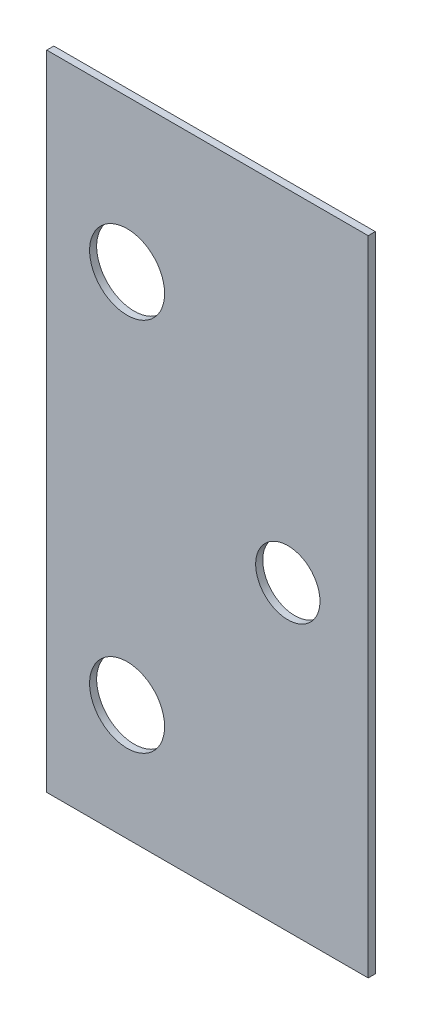
ISO-10303-21;
HEADER;
FILE_DESCRIPTION(('STEP AP214'),'2;1');
FILE_NAME('part.step','',(''),(''),'','','');
FILE_SCHEMA(('AUTOMOTIVE_DESIGN { 1 0 10303 214 1 1 1 1 }'));
ENDSEC;
DATA;
#1=APPLICATION_CONTEXT('core data for automotive mechanical design processes');
#2=APPLICATION_PROTOCOL_DEFINITION('international standard','automotive_design',2000,#1);
#3=PRODUCT_CONTEXT('',#1,'mechanical');
#4=PRODUCT('Part','Part','',(#3));
#5=PRODUCT_RELATED_PRODUCT_CATEGORY('part','',(#4));
#6=PRODUCT_DEFINITION_FORMATION('','',#4);
#7=PRODUCT_DEFINITION_CONTEXT('part definition',#1,'design');
#8=PRODUCT_DEFINITION('design','',#6,#7);
#9=PRODUCT_DEFINITION_SHAPE('','',#8);
#10=(LENGTH_UNIT() NAMED_UNIT(*) SI_UNIT(.MILLI.,.METRE.));
#11=(NAMED_UNIT(*) PLANE_ANGLE_UNIT() SI_UNIT($,.RADIAN.));
#12=(NAMED_UNIT(*) SI_UNIT($,.STERADIAN.) SOLID_ANGLE_UNIT());
#13=UNCERTAINTY_MEASURE_WITH_UNIT(LENGTH_MEASURE(1.E-05),#10,'distance_accuracy_value','');
#14=(GEOMETRIC_REPRESENTATION_CONTEXT(3) GLOBAL_UNCERTAINTY_ASSIGNED_CONTEXT((#13)) GLOBAL_UNIT_ASSIGNED_CONTEXT((#10,
#11,#12)) REPRESENTATION_CONTEXT('',''));
#15=CARTESIAN_POINT('',(0.,0.,0.));
#16=DIRECTION('',(0.,0.,1.));
#17=DIRECTION('',(1.,0.,0.));
#18=AXIS2_PLACEMENT_3D('',#15,#16,#17);
#19=CARTESIAN_POINT('',(15.3599863182634,-35.963655855487,0.8382));
#20=DIRECTION('',(-1.,0.,0.));
#21=DIRECTION('',(0.,-1.,0.));
#22=AXIS2_PLACEMENT_3D('',#19,#20,#21);
#23=PLANE('',#22);
#24=DIRECTION('',(0.,1.,0.));
#25=VECTOR('',#24,1.);
#26=CARTESIAN_POINT('',(15.3599863182634,-35.963655855487,0.));
#27=LINE('',#26,#25);
#28=CARTESIAN_POINT('',(15.3599863182634,-35.963655855487,0.));
#29=VERTEX_POINT('',#28);
#30=CARTESIAN_POINT('',(15.3599863182634,40.236344144513,0.));
#31=VERTEX_POINT('',#30);
#32=EDGE_CURVE('E107',#29,#31,#27,.T.);
#33=ORIENTED_EDGE('',*,*,#32,.T.);
#34=DIRECTION('',(0.,0.,-1.));
#35=VECTOR('',#34,1.);
#36=CARTESIAN_POINT('',(15.3599863182634,40.236344144513,0.8382));
#37=LINE('',#36,#35);
#38=CARTESIAN_POINT('',(15.3599863182634,40.236344144513,0.8382));
#39=VERTEX_POINT('',#38);
#40=EDGE_CURVE('E11',#39,#31,#37,.T.);
#41=ORIENTED_EDGE('',*,*,#40,.F.);
#42=DIRECTION('',(0.,1.,0.));
#43=VECTOR('',#42,1.);
#44=CARTESIAN_POINT('',(15.3599863182634,-35.963655855487,0.8382));
#45=LINE('',#44,#43);
#46=CARTESIAN_POINT('',(15.3599863182634,-35.963655855487,0.8382));
#47=VERTEX_POINT('',#46);
#48=EDGE_CURVE('E91',#47,#39,#45,.T.);
#49=ORIENTED_EDGE('',*,*,#48,.F.);
#50=DIRECTION('',(0.,0.,-1.));
#51=VECTOR('',#50,1.);
#52=CARTESIAN_POINT('',(15.3599863182634,-35.963655855487,0.8382));
#53=LINE('',#52,#51);
#54=EDGE_CURVE('E103',#47,#29,#53,.T.);
#55=ORIENTED_EDGE('',*,*,#54,.T.);
#56=EDGE_LOOP('',(#33,#41,#49,#55));
#57=FACE_BOUND('',#56,.T.);
#58=ADVANCED_FACE('F39',(#57),#23,.F.);
#59=CARTESIAN_POINT('',(-22.7400136817366,40.236344144513,0.8382));
#60=DIRECTION('',(0.,-1.,0.));
#61=DIRECTION('',(0.,0.,-1.));
#62=AXIS2_PLACEMENT_3D('',#59,#60,#61);
#63=PLANE('',#62);
#64=DIRECTION('',(-1.,0.,0.));
#65=VECTOR('',#64,1.);
#66=CARTESIAN_POINT('',(-22.7400136817366,40.236344144513,0.));
#67=LINE('',#66,#65);
#68=CARTESIAN_POINT('',(-22.7400136817366,40.236344144513,0.));
#69=VERTEX_POINT('',#68);
#70=EDGE_CURVE('E96',#31,#69,#67,.T.);
#71=ORIENTED_EDGE('',*,*,#70,.T.);
#72=DIRECTION('',(0.,0.,-1.));
#73=VECTOR('',#72,1.);
#74=CARTESIAN_POINT('',(-22.7400136817366,40.236344144513,0.8382));
#75=LINE('',#74,#73);
#76=CARTESIAN_POINT('',(-22.7400136817366,40.236344144513,0.8382));
#77=VERTEX_POINT('',#76);
#78=EDGE_CURVE('E48',#77,#69,#75,.T.);
#79=ORIENTED_EDGE('',*,*,#78,.F.);
#80=DIRECTION('',(-1.,0.,0.));
#81=VECTOR('',#80,1.);
#82=CARTESIAN_POINT('',(-22.7400136817366,40.236344144513,0.8382));
#83=LINE('',#82,#81);
#84=EDGE_CURVE('E86',#39,#77,#83,.T.);
#85=ORIENTED_EDGE('',*,*,#84,.F.);
#86=ORIENTED_EDGE('',*,*,#40,.T.);
#87=EDGE_LOOP('',(#71,#79,#85,#86));
#88=FACE_BOUND('',#87,.T.);
#89=ADVANCED_FACE('F95',(#88),#63,.F.);
#90=CARTESIAN_POINT('',(-22.7400136817366,-35.963655855487,0.8382));
#91=DIRECTION('',(1.,0.,0.));
#92=DIRECTION('',(0.,1.,0.));
#93=AXIS2_PLACEMENT_3D('',#90,#91,#92);
#94=PLANE('',#93);
#95=DIRECTION('',(0.,-1.,0.));
#96=VECTOR('',#95,1.);
#97=CARTESIAN_POINT('',(-22.7400136817366,-35.963655855487,0.));
#98=LINE('',#97,#96);
#99=CARTESIAN_POINT('',(-22.7400136817366,-35.963655855487,0.));
#100=VERTEX_POINT('',#99);
#101=EDGE_CURVE('E73',#69,#100,#98,.T.);
#102=ORIENTED_EDGE('',*,*,#101,.T.);
#103=DIRECTION('',(0.,0.,-1.));
#104=VECTOR('',#103,1.);
#105=CARTESIAN_POINT('',(-22.7400136817366,-35.963655855487,0.8382));
#106=LINE('',#105,#104);
#107=CARTESIAN_POINT('',(-22.7400136817366,-35.963655855487,0.8382));
#108=VERTEX_POINT('',#107);
#109=EDGE_CURVE('E98',#108,#100,#106,.T.);
#110=ORIENTED_EDGE('',*,*,#109,.F.);
#111=DIRECTION('',(0.,-1.,0.));
#112=VECTOR('',#111,1.);
#113=CARTESIAN_POINT('',(-22.7400136817366,-35.963655855487,0.8382));
#114=LINE('',#113,#112);
#115=EDGE_CURVE('E89',#77,#108,#114,.T.);
#116=ORIENTED_EDGE('',*,*,#115,.F.);
#117=ORIENTED_EDGE('',*,*,#78,.T.);
#118=EDGE_LOOP('',(#102,#110,#116,#117));
#119=FACE_BOUND('',#118,.T.);
#120=ADVANCED_FACE('F99',(#119),#94,.F.);
#121=CARTESIAN_POINT('',(-22.7400136817366,-35.963655855487,0.8382));
#122=DIRECTION('',(0.,1.,0.));
#123=DIRECTION('',(0.,0.,1.));
#124=AXIS2_PLACEMENT_3D('',#121,#122,#123);
#125=PLANE('',#124);
#126=DIRECTION('',(1.,0.,0.));
#127=VECTOR('',#126,1.);
#128=CARTESIAN_POINT('',(-22.7400136817366,-35.963655855487,0.));
#129=LINE('',#128,#127);
#130=EDGE_CURVE('E79',#100,#29,#129,.T.);
#131=ORIENTED_EDGE('',*,*,#130,.T.);
#132=ORIENTED_EDGE('',*,*,#54,.F.);
#133=DIRECTION('',(1.,0.,0.));
#134=VECTOR('',#133,1.);
#135=CARTESIAN_POINT('',(-22.7400136817366,-35.963655855487,0.8382));
#136=LINE('',#135,#134);
#137=EDGE_CURVE('E56',#108,#47,#136,.T.);
#138=ORIENTED_EDGE('',*,*,#137,.F.);
#139=ORIENTED_EDGE('',*,*,#109,.T.);
#140=EDGE_LOOP('',(#131,#132,#138,#139));
#141=FACE_BOUND('',#140,.T.);
#142=ADVANCED_FACE('F121',(#141),#125,.F.);
#143=CARTESIAN_POINT('',(0.,0.,0.8382));
#144=DIRECTION('',(0.,0.,-1.));
#145=DIRECTION('',(-1.,0.,0.));
#146=AXIS2_PLACEMENT_3D('',#143,#144,#145);
#147=PLANE('',#146);
#148=CARTESIAN_POINT('',(5.83498631826342,-0.147316624447058,0.8382));
#149=DIRECTION('',(0.,0.,1.));
#150=DIRECTION('',(1.,0.,0.));
#151=AXIS2_PLACEMENT_3D('',#148,#149,#150);
#152=CIRCLE('',#151,3.81);
#153=CARTESIAN_POINT('',(9.64498631826342,-0.147316624447058,0.8382));
#154=VERTEX_POINT('',#153);
#155=EDGE_CURVE('E144',#154,#154,#152,.T.);
#156=ORIENTED_EDGE('',*,*,#155,.F.);
#157=EDGE_LOOP('',(#156));
#158=FACE_BOUND('',#157,.T.);
#159=CARTESIAN_POINT('',(-13.2150136817366,22.225,0.8382));
#160=DIRECTION('',(0.,0.,1.));
#161=DIRECTION('',(1.,0.,0.));
#162=AXIS2_PLACEMENT_3D('',#159,#160,#161);
#163=CIRCLE('',#162,4.445);
#164=CARTESIAN_POINT('',(-8.7700136817366,22.225,0.8382));
#165=VERTEX_POINT('',#164);
#166=EDGE_CURVE('E136',#165,#165,#163,.T.);
#167=ORIENTED_EDGE('',*,*,#166,.F.);
#168=EDGE_LOOP('',(#167));
#169=FACE_BOUND('',#168,.T.);
#170=CARTESIAN_POINT('',(-13.2150136817366,-22.225,0.8382));
#171=DIRECTION('',(0.,0.,1.));
#172=DIRECTION('',(1.,0.,0.));
#173=AXIS2_PLACEMENT_3D('',#170,#171,#172);
#174=CIRCLE('',#173,4.445);
#175=CARTESIAN_POINT('',(-8.7700136817366,-22.225,0.8382));
#176=VERTEX_POINT('',#175);
#177=EDGE_CURVE('E128',#176,#176,#174,.T.);
#178=ORIENTED_EDGE('',*,*,#177,.F.);
#179=EDGE_LOOP('',(#178));
#180=FACE_BOUND('',#179,.T.);
#181=ORIENTED_EDGE('',*,*,#48,.T.);
#182=ORIENTED_EDGE('',*,*,#84,.T.);
#183=ORIENTED_EDGE('',*,*,#115,.T.);
#184=ORIENTED_EDGE('',*,*,#137,.T.);
#185=EDGE_LOOP('',(#181,#182,#183,#184));
#186=FACE_BOUND('',#185,.T.);
#187=ADVANCED_FACE('F87',(#158,#169,#180,#186),#147,.F.);
#188=CARTESIAN_POINT('',(0.,0.,0.));
#189=DIRECTION('',(0.,0.,-1.));
#190=DIRECTION('',(-1.,0.,0.));
#191=AXIS2_PLACEMENT_3D('',#188,#189,#190);
#192=PLANE('',#191);
#193=CARTESIAN_POINT('',(5.83498631826342,-0.147316624447058,0.));
#194=DIRECTION('',(0.,0.,1.));
#195=DIRECTION('',(1.,0.,0.));
#196=AXIS2_PLACEMENT_3D('',#193,#194,#195);
#197=CIRCLE('',#196,3.81);
#198=CARTESIAN_POINT('',(9.64498631826342,-0.147316624447058,0.));
#199=VERTEX_POINT('',#198);
#200=EDGE_CURVE('E111',#199,#199,#197,.T.);
#201=ORIENTED_EDGE('',*,*,#200,.T.);
#202=EDGE_LOOP('',(#201));
#203=FACE_BOUND('',#202,.T.);
#204=CARTESIAN_POINT('',(-13.2150136817366,22.225,0.));
#205=DIRECTION('',(0.,0.,1.));
#206=DIRECTION('',(1.,0.,0.));
#207=AXIS2_PLACEMENT_3D('',#204,#205,#206);
#208=CIRCLE('',#207,4.445);
#209=CARTESIAN_POINT('',(-8.7700136817366,22.225,0.));
#210=VERTEX_POINT('',#209);
#211=EDGE_CURVE('E140',#210,#210,#208,.T.);
#212=ORIENTED_EDGE('',*,*,#211,.T.);
#213=EDGE_LOOP('',(#212));
#214=FACE_BOUND('',#213,.T.);
#215=CARTESIAN_POINT('',(-13.2150136817366,-22.225,0.));
#216=DIRECTION('',(0.,0.,1.));
#217=DIRECTION('',(1.,0.,0.));
#218=AXIS2_PLACEMENT_3D('',#215,#216,#217);
#219=CIRCLE('',#218,4.445);
#220=CARTESIAN_POINT('',(-8.7700136817366,-22.225,0.));
#221=VERTEX_POINT('',#220);
#222=EDGE_CURVE('E132',#221,#221,#219,.T.);
#223=ORIENTED_EDGE('',*,*,#222,.T.);
#224=EDGE_LOOP('',(#223));
#225=FACE_BOUND('',#224,.T.);
#226=ORIENTED_EDGE('',*,*,#32,.F.);
#227=ORIENTED_EDGE('',*,*,#130,.F.);
#228=ORIENTED_EDGE('',*,*,#101,.F.);
#229=ORIENTED_EDGE('',*,*,#70,.F.);
#230=EDGE_LOOP('',(#226,#227,#228,#229));
#231=FACE_BOUND('',#230,.T.);
#232=ADVANCED_FACE('F124',(#203,#214,#225,#231),#192,.T.);
#233=CARTESIAN_POINT('',(-13.2150136817366,-22.225,0.));
#234=DIRECTION('',(0.,0.,1.));
#235=DIRECTION('',(1.,0.,0.));
#236=AXIS2_PLACEMENT_3D('',#233,#234,#235);
#237=CYLINDRICAL_SURFACE('',#236,4.445);
#238=ORIENTED_EDGE('',*,*,#222,.F.);
#239=EDGE_LOOP('',(#238));
#240=FACE_BOUND('',#239,.T.);
#241=ORIENTED_EDGE('',*,*,#177,.T.);
#242=EDGE_LOOP('',(#241));
#243=FACE_BOUND('',#242,.T.);
#244=ADVANCED_FACE('F168',(#240,#243),#237,.F.);
#245=CARTESIAN_POINT('',(-13.2150136817366,22.225,0.));
#246=DIRECTION('',(0.,0.,1.));
#247=DIRECTION('',(1.,0.,0.));
#248=AXIS2_PLACEMENT_3D('',#245,#246,#247);
#249=CYLINDRICAL_SURFACE('',#248,4.445);
#250=ORIENTED_EDGE('',*,*,#211,.F.);
#251=EDGE_LOOP('',(#250));
#252=FACE_BOUND('',#251,.T.);
#253=ORIENTED_EDGE('',*,*,#166,.T.);
#254=EDGE_LOOP('',(#253));
#255=FACE_BOUND('',#254,.T.);
#256=ADVANCED_FACE('F157',(#252,#255),#249,.F.);
#257=CARTESIAN_POINT('',(5.83498631826342,-0.147316624447058,0.));
#258=DIRECTION('',(0.,0.,1.));
#259=DIRECTION('',(1.,0.,0.));
#260=AXIS2_PLACEMENT_3D('',#257,#258,#259);
#261=CYLINDRICAL_SURFACE('',#260,3.81);
#262=ORIENTED_EDGE('',*,*,#200,.F.);
#263=EDGE_LOOP('',(#262));
#264=FACE_BOUND('',#263,.T.);
#265=ORIENTED_EDGE('',*,*,#155,.T.);
#266=EDGE_LOOP('',(#265));
#267=FACE_BOUND('',#266,.T.);
#268=ADVANCED_FACE('F154',(#264,#267),#261,.F.);
#269=CLOSED_SHELL('',(#58,#89,#120,#142,#187,#232,#244,#256,#268));
#270=MANIFOLD_SOLID_BREP('B2',#269);
#271=ADVANCED_BREP_SHAPE_REPRESENTATION('',(#18,#270),#14);
#272=SHAPE_DEFINITION_REPRESENTATION(#9,#271);
ENDSEC;
END-ISO-10303-21;
